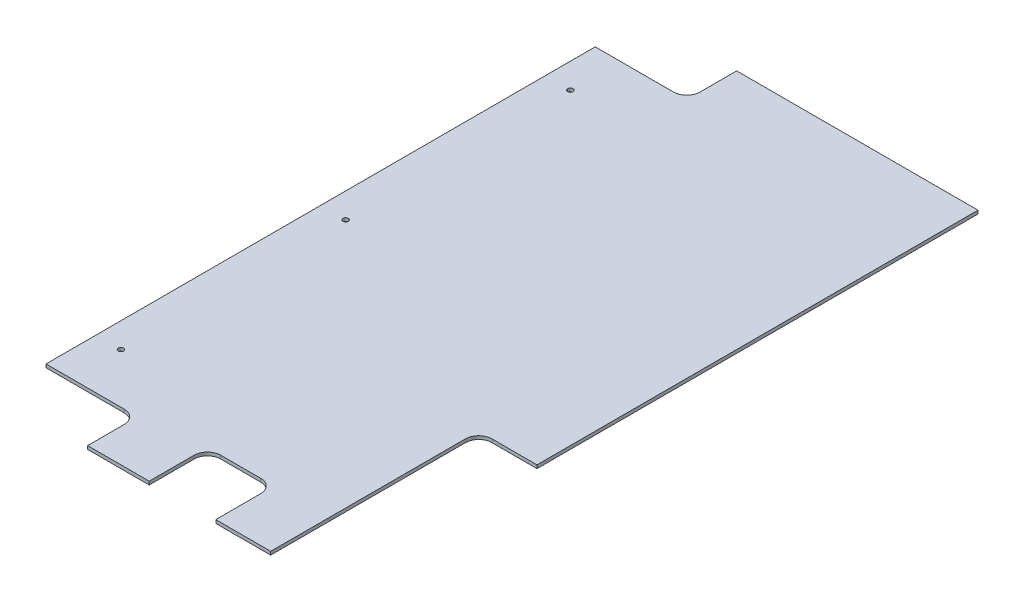
ISO-10303-21;
HEADER;
FILE_DESCRIPTION(('STEP AP214'),'2;1');
FILE_NAME('part.step','',(''),(''),'','','');
FILE_SCHEMA(('AUTOMOTIVE_DESIGN { 1 0 10303 214 1 1 1 1 }'));
ENDSEC;
DATA;
#1=APPLICATION_CONTEXT('core data for automotive mechanical design processes');
#2=APPLICATION_PROTOCOL_DEFINITION('international standard','automotive_design',2000,#1);
#3=PRODUCT_CONTEXT('',#1,'mechanical');
#4=PRODUCT('Part','Part','',(#3));
#5=PRODUCT_RELATED_PRODUCT_CATEGORY('part','',(#4));
#6=PRODUCT_DEFINITION_FORMATION('','',#4);
#7=PRODUCT_DEFINITION_CONTEXT('part definition',#1,'design');
#8=PRODUCT_DEFINITION('design','',#6,#7);
#9=PRODUCT_DEFINITION_SHAPE('','',#8);
#10=(LENGTH_UNIT() NAMED_UNIT(*) SI_UNIT(.MILLI.,.METRE.));
#11=(NAMED_UNIT(*) PLANE_ANGLE_UNIT() SI_UNIT($,.RADIAN.));
#12=(NAMED_UNIT(*) SI_UNIT($,.STERADIAN.) SOLID_ANGLE_UNIT());
#13=UNCERTAINTY_MEASURE_WITH_UNIT(LENGTH_MEASURE(1.E-05),#10,'distance_accuracy_value','');
#14=(GEOMETRIC_REPRESENTATION_CONTEXT(3) GLOBAL_UNCERTAINTY_ASSIGNED_CONTEXT((#13)) GLOBAL_UNIT_ASSIGNED_CONTEXT((#10,
#11,#12)) REPRESENTATION_CONTEXT('',''));
#15=CARTESIAN_POINT('',(0.,0.,0.));
#16=DIRECTION('',(0.,0.,1.));
#17=DIRECTION('',(1.,0.,0.));
#18=AXIS2_PLACEMENT_3D('',#15,#16,#17);
#19=CARTESIAN_POINT('',(0.,2.,0.));
#20=DIRECTION('',(0.,0.,-1.));
#21=DIRECTION('',(-1.,0.,0.));
#22=AXIS2_PLACEMENT_3D('',#19,#20,#21);
#23=PLANE('',#22);
#24=DIRECTION('',(1.,0.,0.));
#25=VECTOR('',#24,1.);
#26=CARTESIAN_POINT('',(0.,0.,0.));
#27=LINE('',#26,#25);
#28=CARTESIAN_POINT('',(132.,0.,0.));
#29=VERTEX_POINT('',#28);
#30=CARTESIAN_POINT('',(165.,0.,0.));
#31=VERTEX_POINT('',#30);
#32=EDGE_CURVE('E194',#29,#31,#27,.T.);
#33=ORIENTED_EDGE('',*,*,#32,.T.);
#34=DIRECTION('',(0.,1.,0.));
#35=VECTOR('',#34,1.);
#36=CARTESIAN_POINT('',(165.,-129.807549857472,0.));
#37=LINE('',#36,#35);
#38=CARTESIAN_POINT('',(165.,2.,0.));
#39=VERTEX_POINT('',#38);
#40=EDGE_CURVE('E180',#31,#39,#37,.T.);
#41=ORIENTED_EDGE('',*,*,#40,.T.);
#42=DIRECTION('',(1.,0.,0.));
#43=VECTOR('',#42,1.);
#44=CARTESIAN_POINT('',(0.,2.,0.));
#45=LINE('',#44,#43);
#46=CARTESIAN_POINT('',(132.,2.,0.));
#47=VERTEX_POINT('',#46);
#48=EDGE_CURVE('E192',#47,#39,#45,.T.);
#49=ORIENTED_EDGE('',*,*,#48,.F.);
#50=DIRECTION('',(0.,1.,0.));
#51=VECTOR('',#50,1.);
#52=CARTESIAN_POINT('',(132.,-53.1507290636733,0.));
#53=LINE('',#52,#51);
#54=EDGE_CURVE('E297',#29,#47,#53,.T.);
#55=ORIENTED_EDGE('',*,*,#54,.F.);
#56=EDGE_LOOP('',(#33,#41,#49,#55));
#57=FACE_BOUND('',#56,.T.);
#58=ADVANCED_FACE('F39',(#57),#23,.F.);
#59=CARTESIAN_POINT('',(0.,2.,0.));
#60=DIRECTION('',(1.,0.,0.));
#61=DIRECTION('',(0.,0.,-1.));
#62=AXIS2_PLACEMENT_3D('',#59,#60,#61);
#63=PLANE('',#62);
#64=DIRECTION('',(0.,0.,1.));
#65=VECTOR('',#64,1.);
#66=CARTESIAN_POINT('',(0.,2.,0.));
#67=LINE('',#66,#65);
#68=CARTESIAN_POINT('',(0.,2.,-360.));
#69=VERTEX_POINT('',#68);
#70=CARTESIAN_POINT('',(0.,2.,-30.));
#71=VERTEX_POINT('',#70);
#72=EDGE_CURVE('E203',#69,#71,#67,.T.);
#73=ORIENTED_EDGE('',*,*,#72,.F.);
#74=DIRECTION('',(0.,1.,0.));
#75=VECTOR('',#74,1.);
#76=CARTESIAN_POINT('',(0.,-62.6498204307084,-360.));
#77=LINE('',#76,#75);
#78=CARTESIAN_POINT('',(0.,0.,-360.));
#79=VERTEX_POINT('',#78);
#80=EDGE_CURVE('E221',#79,#69,#77,.T.);
#81=ORIENTED_EDGE('',*,*,#80,.F.);
#82=DIRECTION('',(0.,0.,1.));
#83=VECTOR('',#82,1.);
#84=CARTESIAN_POINT('',(0.,0.,0.));
#85=LINE('',#84,#83);
#86=CARTESIAN_POINT('',(0.,0.,-30.));
#87=VERTEX_POINT('',#86);
#88=EDGE_CURVE('E218',#79,#87,#85,.T.);
#89=ORIENTED_EDGE('',*,*,#88,.T.);
#90=DIRECTION('',(0.,1.,0.));
#91=VECTOR('',#90,1.);
#92=CARTESIAN_POINT('',(0.,-62.6498204307084,-30.));
#93=LINE('',#92,#91);
#94=EDGE_CURVE('E333',#87,#71,#93,.T.);
#95=ORIENTED_EDGE('',*,*,#94,.T.);
#96=EDGE_LOOP('',(#73,#81,#89,#95));
#97=FACE_BOUND('',#96,.T.);
#98=ADVANCED_FACE('F364',(#97),#63,.F.);
#99=CARTESIAN_POINT('',(55.,0.,0.));
#100=VERTEX_POINT('',#99);
#101=CARTESIAN_POINT('',(92.,0.,0.));
#102=VERTEX_POINT('',#101);
#103=EDGE_CURVE('E222',#100,#102,#27,.T.);
#104=ORIENTED_EDGE('',*,*,#103,.T.);
#105=DIRECTION('',(0.,1.,0.));
#106=VECTOR('',#105,1.);
#107=CARTESIAN_POINT('',(92.,-53.1507290636733,0.));
#108=LINE('',#107,#106);
#109=CARTESIAN_POINT('',(92.,2.,0.));
#110=VERTEX_POINT('',#109);
#111=EDGE_CURVE('E304',#102,#110,#108,.T.);
#112=ORIENTED_EDGE('',*,*,#111,.T.);
#113=CARTESIAN_POINT('',(55.,2.,0.));
#114=VERTEX_POINT('',#113);
#115=EDGE_CURVE('E202',#114,#110,#45,.T.);
#116=ORIENTED_EDGE('',*,*,#115,.F.);
#117=DIRECTION('',(0.,1.,0.));
#118=VECTOR('',#117,1.);
#119=CARTESIAN_POINT('',(55.,-62.6498204307084,0.));
#120=LINE('',#119,#118);
#121=EDGE_CURVE('E316',#100,#114,#120,.T.);
#122=ORIENTED_EDGE('',*,*,#121,.F.);
#123=EDGE_LOOP('',(#104,#112,#116,#122));
#124=FACE_BOUND('',#123,.T.);
#125=ADVANCED_FACE('F345',(#124),#23,.F.);
#126=CARTESIAN_POINT('',(200.,2.,0.));
#127=DIRECTION('',(-1.,0.,0.));
#128=DIRECTION('',(0.,0.,1.));
#129=AXIS2_PLACEMENT_3D('',#126,#127,#128);
#130=PLANE('',#129);
#131=DIRECTION('',(0.,0.,-1.));
#132=VECTOR('',#131,1.);
#133=CARTESIAN_POINT('',(200.,2.,0.));
#134=LINE('',#133,#132);
#135=CARTESIAN_POINT('',(200.,2.,-125.));
#136=VERTEX_POINT('',#135);
#137=CARTESIAN_POINT('',(200.,2.,-390.));
#138=VERTEX_POINT('',#137);
#139=EDGE_CURVE('E206',#136,#138,#134,.T.);
#140=ORIENTED_EDGE('',*,*,#139,.F.);
#141=DIRECTION('',(0.,1.,0.));
#142=VECTOR('',#141,1.);
#143=CARTESIAN_POINT('',(200.,-129.807549857472,-125.));
#144=LINE('',#143,#142);
#145=CARTESIAN_POINT('',(200.,0.,-125.));
#146=VERTEX_POINT('',#145);
#147=EDGE_CURVE('E195',#146,#136,#144,.T.);
#148=ORIENTED_EDGE('',*,*,#147,.F.);
#149=DIRECTION('',(0.,0.,-1.));
#150=VECTOR('',#149,1.);
#151=CARTESIAN_POINT('',(200.,0.,0.));
#152=LINE('',#151,#150);
#153=CARTESIAN_POINT('',(200.,0.,-390.));
#154=VERTEX_POINT('',#153);
#155=EDGE_CURVE('E225',#146,#154,#152,.T.);
#156=ORIENTED_EDGE('',*,*,#155,.T.);
#157=DIRECTION('',(0.,-1.,0.));
#158=VECTOR('',#157,1.);
#159=CARTESIAN_POINT('',(200.,2.,-390.));
#160=LINE('',#159,#158);
#161=EDGE_CURVE('E217',#138,#154,#160,.T.);
#162=ORIENTED_EDGE('',*,*,#161,.F.);
#163=EDGE_LOOP('',(#140,#148,#156,#162));
#164=FACE_BOUND('',#163,.T.);
#165=ADVANCED_FACE('F384',(#164),#130,.F.);
#166=CARTESIAN_POINT('',(0.,2.,-390.));
#167=DIRECTION('',(0.,0.,1.));
#168=DIRECTION('',(1.,0.,0.));
#169=AXIS2_PLACEMENT_3D('',#166,#167,#168);
#170=PLANE('',#169);
#171=DIRECTION('',(-1.,0.,0.));
#172=VECTOR('',#171,1.);
#173=CARTESIAN_POINT('',(0.,0.,-390.));
#174=LINE('',#173,#172);
#175=CARTESIAN_POINT('',(55.,0.,-390.));
#176=VERTEX_POINT('',#175);
#177=EDGE_CURVE('E208',#154,#176,#174,.T.);
#178=ORIENTED_EDGE('',*,*,#177,.T.);
#179=DIRECTION('',(0.,1.,0.));
#180=VECTOR('',#179,1.);
#181=CARTESIAN_POINT('',(55.,-62.6498204307084,-390.));
#182=LINE('',#181,#180);
#183=CARTESIAN_POINT('',(55.,2.,-390.));
#184=VERTEX_POINT('',#183);
#185=EDGE_CURVE('E320',#176,#184,#182,.T.);
#186=ORIENTED_EDGE('',*,*,#185,.T.);
#187=DIRECTION('',(-1.,0.,0.));
#188=VECTOR('',#187,1.);
#189=CARTESIAN_POINT('',(0.,2.,-390.));
#190=LINE('',#189,#188);
#191=EDGE_CURVE('E214',#138,#184,#190,.T.);
#192=ORIENTED_EDGE('',*,*,#191,.F.);
#193=ORIENTED_EDGE('',*,*,#161,.T.);
#194=EDGE_LOOP('',(#178,#186,#192,#193));
#195=FACE_BOUND('',#194,.T.);
#196=ADVANCED_FACE('F378',(#195),#170,.F.);
#197=CARTESIAN_POINT('',(0.,2.,0.));
#198=DIRECTION('',(0.,-1.,0.));
#199=DIRECTION('',(0.,0.,-1.));
#200=AXIS2_PLACEMENT_3D('',#197,#198,#199);
#201=PLANE('',#200);
#202=CARTESIAN_POINT('',(15.05,2.,-330.));
#203=DIRECTION('',(0.,1.,0.));
#204=DIRECTION('',(0.,0.,1.));
#205=AXIS2_PLACEMENT_3D('',#202,#203,#204);
#206=CIRCLE('',#205,1.59999999999999);
#207=CARTESIAN_POINT('',(15.05,2.,-328.4));
#208=VERTEX_POINT('',#207);
#209=EDGE_CURVE('E406',#208,#208,#206,.T.);
#210=ORIENTED_EDGE('',*,*,#209,.F.);
#211=EDGE_LOOP('',(#210));
#212=FACE_BOUND('',#211,.T.);
#213=CARTESIAN_POINT('',(15.05,2.,-195.));
#214=DIRECTION('',(0.,1.,0.));
#215=DIRECTION('',(0.,0.,1.));
#216=AXIS2_PLACEMENT_3D('',#213,#214,#215);
#217=CIRCLE('',#216,1.59999999999999);
#218=CARTESIAN_POINT('',(15.05,2.,-193.4));
#219=VERTEX_POINT('',#218);
#220=EDGE_CURVE('E399',#219,#219,#217,.T.);
#221=ORIENTED_EDGE('',*,*,#220,.F.);
#222=EDGE_LOOP('',(#221));
#223=FACE_BOUND('',#222,.T.);
#224=CARTESIAN_POINT('',(15.05,2.,-60.0000000000001));
#225=DIRECTION('',(0.,1.,0.));
#226=DIRECTION('',(0.,0.,1.));
#227=AXIS2_PLACEMENT_3D('',#224,#225,#226);
#228=CIRCLE('',#227,1.6);
#229=CARTESIAN_POINT('',(15.05,2.,-58.4));
#230=VERTEX_POINT('',#229);
#231=EDGE_CURVE('E400',#230,#230,#228,.T.);
#232=ORIENTED_EDGE('',*,*,#231,.F.);
#233=EDGE_LOOP('',(#232));
#234=FACE_BOUND('',#233,.T.);
#235=DIRECTION('',(0.,0.,1.));
#236=VECTOR('',#235,1.);
#237=CARTESIAN_POINT('',(165.,2.,0.));
#238=LINE('',#237,#236);
#239=CARTESIAN_POINT('',(165.,2.,-117.));
#240=VERTEX_POINT('',#239);
#241=EDGE_CURVE('E176',#240,#39,#238,.T.);
#242=ORIENTED_EDGE('',*,*,#241,.F.);
#243=CARTESIAN_POINT('',(173.,2.,-117.));
#244=DIRECTION('',(0.,-1.,0.));
#245=DIRECTION('',(0.,0.,-1.));
#246=AXIS2_PLACEMENT_3D('',#243,#244,#245);
#247=CIRCLE('',#246,8.);
#248=CARTESIAN_POINT('',(173.,2.,-125.));
#249=VERTEX_POINT('',#248);
#250=EDGE_CURVE('E256',#240,#249,#247,.T.);
#251=ORIENTED_EDGE('',*,*,#250,.T.);
#252=DIRECTION('',(-1.,0.,0.));
#253=VECTOR('',#252,1.);
#254=CARTESIAN_POINT('',(200.,2.,-125.));
#255=LINE('',#254,#253);
#256=EDGE_CURVE('E187',#136,#249,#255,.T.);
#257=ORIENTED_EDGE('',*,*,#256,.F.);
#258=ORIENTED_EDGE('',*,*,#139,.T.);
#259=ORIENTED_EDGE('',*,*,#191,.T.);
#260=DIRECTION('',(0.,0.,-1.));
#261=VECTOR('',#260,1.);
#262=CARTESIAN_POINT('',(55.,2.,-390.));
#263=LINE('',#262,#261);
#264=CARTESIAN_POINT('',(55.,2.,-368.));
#265=VERTEX_POINT('',#264);
#266=EDGE_CURVE('E311',#265,#184,#263,.T.);
#267=ORIENTED_EDGE('',*,*,#266,.F.);
#268=CARTESIAN_POINT('',(47.,2.,-368.));
#269=DIRECTION('',(0.,-1.,0.));
#270=DIRECTION('',(0.,0.,-1.));
#271=AXIS2_PLACEMENT_3D('',#268,#269,#270);
#272=CIRCLE('',#271,8.);
#273=CARTESIAN_POINT('',(47.,2.,-360.));
#274=VERTEX_POINT('',#273);
#275=EDGE_CURVE('E47',#265,#274,#272,.T.);
#276=ORIENTED_EDGE('',*,*,#275,.T.);
#277=DIRECTION('',(1.,0.,0.));
#278=VECTOR('',#277,1.);
#279=CARTESIAN_POINT('',(0.,2.,-360.));
#280=LINE('',#279,#278);
#281=EDGE_CURVE('E314',#69,#274,#280,.T.);
#282=ORIENTED_EDGE('',*,*,#281,.F.);
#283=ORIENTED_EDGE('',*,*,#72,.T.);
#284=DIRECTION('',(-1.,0.,0.));
#285=VECTOR('',#284,1.);
#286=CARTESIAN_POINT('',(0.,2.,-30.));
#287=LINE('',#286,#285);
#288=CARTESIAN_POINT('',(47.,2.,-30.));
#289=VERTEX_POINT('',#288);
#290=EDGE_CURVE('E324',#289,#71,#287,.T.);
#291=ORIENTED_EDGE('',*,*,#290,.F.);
#292=CARTESIAN_POINT('',(47.,2.,-22.));
#293=DIRECTION('',(0.,-1.,0.));
#294=DIRECTION('',(0.,0.,-1.));
#295=AXIS2_PLACEMENT_3D('',#292,#293,#294);
#296=CIRCLE('',#295,8.);
#297=CARTESIAN_POINT('',(55.,2.,-22.));
#298=VERTEX_POINT('',#297);
#299=EDGE_CURVE('E262',#289,#298,#296,.T.);
#300=ORIENTED_EDGE('',*,*,#299,.T.);
#301=DIRECTION('',(0.,0.,-1.));
#302=VECTOR('',#301,1.);
#303=CARTESIAN_POINT('',(55.,2.,0.));
#304=LINE('',#303,#302);
#305=EDGE_CURVE('E310',#114,#298,#304,.T.);
#306=ORIENTED_EDGE('',*,*,#305,.F.);
#307=ORIENTED_EDGE('',*,*,#115,.T.);
#308=DIRECTION('',(0.,0.,1.));
#309=VECTOR('',#308,1.);
#310=CARTESIAN_POINT('',(92.,2.,0.));
#311=LINE('',#310,#309);
#312=CARTESIAN_POINT('',(92.,2.,-27.));
#313=VERTEX_POINT('',#312);
#314=EDGE_CURVE('E298',#313,#110,#311,.T.);
#315=ORIENTED_EDGE('',*,*,#314,.F.);
#316=CARTESIAN_POINT('',(100.,2.,-27.));
#317=DIRECTION('',(0.,-1.,0.));
#318=DIRECTION('',(0.,0.,-1.));
#319=AXIS2_PLACEMENT_3D('',#316,#317,#318);
#320=CIRCLE('',#319,8.);
#321=CARTESIAN_POINT('',(100.,2.,-35.));
#322=VERTEX_POINT('',#321);
#323=EDGE_CURVE('E266',#313,#322,#320,.T.);
#324=ORIENTED_EDGE('',*,*,#323,.T.);
#325=DIRECTION('',(-1.,0.,0.));
#326=VECTOR('',#325,1.);
#327=CARTESIAN_POINT('',(92.,2.,-35.));
#328=LINE('',#327,#326);
#329=CARTESIAN_POINT('',(124.,2.,-35.));
#330=VERTEX_POINT('',#329);
#331=EDGE_CURVE('E294',#330,#322,#328,.T.);
#332=ORIENTED_EDGE('',*,*,#331,.F.);
#333=CARTESIAN_POINT('',(124.,2.,-27.));
#334=DIRECTION('',(0.,-1.,0.));
#335=DIRECTION('',(0.,0.,-1.));
#336=AXIS2_PLACEMENT_3D('',#333,#334,#335);
#337=CIRCLE('',#336,8.);
#338=CARTESIAN_POINT('',(132.,2.,-27.));
#339=VERTEX_POINT('',#338);
#340=EDGE_CURVE('E270',#330,#339,#337,.T.);
#341=ORIENTED_EDGE('',*,*,#340,.T.);
#342=DIRECTION('',(0.,0.,-1.));
#343=VECTOR('',#342,1.);
#344=CARTESIAN_POINT('',(132.,2.,0.));
#345=LINE('',#344,#343);
#346=EDGE_CURVE('E201',#47,#339,#345,.T.);
#347=ORIENTED_EDGE('',*,*,#346,.F.);
#348=ORIENTED_EDGE('',*,*,#48,.T.);
#349=EDGE_LOOP('',(#242,#251,#257,#258,#259,#267,#276,#282,#283,#291,#300,#306,#307,#315,#324,
#332,#341,#347,#348));
#350=FACE_BOUND('',#349,.T.);
#351=ADVANCED_FACE('F199',(#212,#223,#234,#350),#201,.F.);
#352=CARTESIAN_POINT('',(0.,0.,0.));
#353=DIRECTION('',(0.,-1.,0.));
#354=DIRECTION('',(0.,0.,-1.));
#355=AXIS2_PLACEMENT_3D('',#352,#353,#354);
#356=PLANE('',#355);
#357=CARTESIAN_POINT('',(15.05,0.,-330.));
#358=DIRECTION('',(0.,-1.,0.));
#359=DIRECTION('',(0.,0.,-1.));
#360=AXIS2_PLACEMENT_3D('',#357,#358,#359);
#361=CIRCLE('',#360,1.59999999999999);
#362=CARTESIAN_POINT('',(15.05,0.,-331.6));
#363=VERTEX_POINT('',#362);
#364=EDGE_CURVE('E394',#363,#363,#361,.F.);
#365=ORIENTED_EDGE('',*,*,#364,.T.);
#366=EDGE_LOOP('',(#365));
#367=FACE_BOUND('',#366,.T.);
#368=CARTESIAN_POINT('',(15.05,0.,-195.));
#369=DIRECTION('',(0.,-1.,0.));
#370=DIRECTION('',(0.,0.,-1.));
#371=AXIS2_PLACEMENT_3D('',#368,#369,#370);
#372=CIRCLE('',#371,1.59999999999999);
#373=CARTESIAN_POINT('',(15.05,0.,-196.6));
#374=VERTEX_POINT('',#373);
#375=EDGE_CURVE('E403',#374,#374,#372,.F.);
#376=ORIENTED_EDGE('',*,*,#375,.T.);
#377=EDGE_LOOP('',(#376));
#378=FACE_BOUND('',#377,.T.);
#379=CARTESIAN_POINT('',(15.05,0.,-60.0000000000001));
#380=DIRECTION('',(0.,-1.,0.));
#381=DIRECTION('',(0.,0.,-1.));
#382=AXIS2_PLACEMENT_3D('',#379,#380,#381);
#383=CIRCLE('',#382,1.6);
#384=CARTESIAN_POINT('',(15.05,0.,-61.6000000000001));
#385=VERTEX_POINT('',#384);
#386=EDGE_CURVE('E396',#385,#385,#383,.F.);
#387=ORIENTED_EDGE('',*,*,#386,.T.);
#388=EDGE_LOOP('',(#387));
#389=FACE_BOUND('',#388,.T.);
#390=DIRECTION('',(-1.,0.,0.));
#391=VECTOR('',#390,1.);
#392=CARTESIAN_POINT('',(200.,0.,-125.));
#393=LINE('',#392,#391);
#394=CARTESIAN_POINT('',(173.,0.,-125.));
#395=VERTEX_POINT('',#394);
#396=EDGE_CURVE('E186',#146,#395,#393,.T.);
#397=ORIENTED_EDGE('',*,*,#396,.T.);
#398=CARTESIAN_POINT('',(173.,0.,-117.));
#399=DIRECTION('',(0.,-1.,0.));
#400=DIRECTION('',(0.,0.,-1.));
#401=AXIS2_PLACEMENT_3D('',#398,#399,#400);
#402=CIRCLE('',#401,8.);
#403=CARTESIAN_POINT('',(165.,0.,-117.));
#404=VERTEX_POINT('',#403);
#405=EDGE_CURVE('E259',#395,#404,#402,.F.);
#406=ORIENTED_EDGE('',*,*,#405,.T.);
#407=DIRECTION('',(0.,0.,1.));
#408=VECTOR('',#407,1.);
#409=CARTESIAN_POINT('',(165.,0.,0.));
#410=LINE('',#409,#408);
#411=EDGE_CURVE('E196',#404,#31,#410,.T.);
#412=ORIENTED_EDGE('',*,*,#411,.T.);
#413=ORIENTED_EDGE('',*,*,#32,.F.);
#414=DIRECTION('',(0.,0.,-1.));
#415=VECTOR('',#414,1.);
#416=CARTESIAN_POINT('',(132.,0.,0.));
#417=LINE('',#416,#415);
#418=CARTESIAN_POINT('',(132.,0.,-27.));
#419=VERTEX_POINT('',#418);
#420=EDGE_CURVE('E282',#29,#419,#417,.T.);
#421=ORIENTED_EDGE('',*,*,#420,.T.);
#422=CARTESIAN_POINT('',(124.,0.,-27.));
#423=DIRECTION('',(0.,-1.,0.));
#424=DIRECTION('',(0.,0.,-1.));
#425=AXIS2_PLACEMENT_3D('',#422,#423,#424);
#426=CIRCLE('',#425,8.);
#427=CARTESIAN_POINT('',(124.,0.,-35.));
#428=VERTEX_POINT('',#427);
#429=EDGE_CURVE('E272',#419,#428,#426,.F.);
#430=ORIENTED_EDGE('',*,*,#429,.T.);
#431=DIRECTION('',(-1.,0.,0.));
#432=VECTOR('',#431,1.);
#433=CARTESIAN_POINT('',(92.,0.,-35.));
#434=LINE('',#433,#432);
#435=CARTESIAN_POINT('',(100.,0.,-35.));
#436=VERTEX_POINT('',#435);
#437=EDGE_CURVE('E280',#428,#436,#434,.T.);
#438=ORIENTED_EDGE('',*,*,#437,.T.);
#439=CARTESIAN_POINT('',(100.,0.,-27.));
#440=DIRECTION('',(0.,-1.,0.));
#441=DIRECTION('',(0.,0.,-1.));
#442=AXIS2_PLACEMENT_3D('',#439,#440,#441);
#443=CIRCLE('',#442,8.);
#444=CARTESIAN_POINT('',(92.,0.,-27.));
#445=VERTEX_POINT('',#444);
#446=EDGE_CURVE('E268',#436,#445,#443,.F.);
#447=ORIENTED_EDGE('',*,*,#446,.T.);
#448=DIRECTION('',(0.,0.,1.));
#449=VECTOR('',#448,1.);
#450=CARTESIAN_POINT('',(92.,0.,0.));
#451=LINE('',#450,#449);
#452=EDGE_CURVE('E291',#445,#102,#451,.T.);
#453=ORIENTED_EDGE('',*,*,#452,.T.);
#454=ORIENTED_EDGE('',*,*,#103,.F.);
#455=DIRECTION('',(0.,0.,-1.));
#456=VECTOR('',#455,1.);
#457=CARTESIAN_POINT('',(55.,0.,0.));
#458=LINE('',#457,#456);
#459=CARTESIAN_POINT('',(55.,0.,-22.));
#460=VERTEX_POINT('',#459);
#461=EDGE_CURVE('E326',#100,#460,#458,.T.);
#462=ORIENTED_EDGE('',*,*,#461,.T.);
#463=CARTESIAN_POINT('',(47.,0.,-22.));
#464=DIRECTION('',(0.,-1.,0.));
#465=DIRECTION('',(0.,0.,-1.));
#466=AXIS2_PLACEMENT_3D('',#463,#464,#465);
#467=CIRCLE('',#466,8.);
#468=CARTESIAN_POINT('',(47.,0.,-30.));
#469=VERTEX_POINT('',#468);
#470=EDGE_CURVE('E264',#460,#469,#467,.F.);
#471=ORIENTED_EDGE('',*,*,#470,.T.);
#472=DIRECTION('',(-1.,0.,0.));
#473=VECTOR('',#472,1.);
#474=CARTESIAN_POINT('',(0.,0.,-30.));
#475=LINE('',#474,#473);
#476=EDGE_CURVE('E331',#469,#87,#475,.T.);
#477=ORIENTED_EDGE('',*,*,#476,.T.);
#478=ORIENTED_EDGE('',*,*,#88,.F.);
#479=DIRECTION('',(1.,0.,0.));
#480=VECTOR('',#479,1.);
#481=CARTESIAN_POINT('',(0.,0.,-360.));
#482=LINE('',#481,#480);
#483=CARTESIAN_POINT('',(47.,0.,-360.));
#484=VERTEX_POINT('',#483);
#485=EDGE_CURVE('E313',#79,#484,#482,.T.);
#486=ORIENTED_EDGE('',*,*,#485,.T.);
#487=CARTESIAN_POINT('',(47.,0.,-368.));
#488=DIRECTION('',(0.,-1.,0.));
#489=DIRECTION('',(0.,0.,-1.));
#490=AXIS2_PLACEMENT_3D('',#487,#488,#489);
#491=CIRCLE('',#490,8.);
#492=CARTESIAN_POINT('',(55.,0.,-368.));
#493=VERTEX_POINT('',#492);
#494=EDGE_CURVE('E11',#484,#493,#491,.F.);
#495=ORIENTED_EDGE('',*,*,#494,.T.);
#496=DIRECTION('',(0.,0.,-1.));
#497=VECTOR('',#496,1.);
#498=CARTESIAN_POINT('',(55.,0.,-390.));
#499=LINE('',#498,#497);
#500=EDGE_CURVE('E318',#493,#176,#499,.T.);
#501=ORIENTED_EDGE('',*,*,#500,.T.);
#502=ORIENTED_EDGE('',*,*,#177,.F.);
#503=ORIENTED_EDGE('',*,*,#155,.F.);
#504=EDGE_LOOP('',(#397,#406,#412,#413,#421,#430,#438,#447,#453,#454,#462,#471,#477,#478,#486,
#495,#501,#502,#503));
#505=FACE_BOUND('',#504,.T.);
#506=ADVANCED_FACE('F279',(#367,#378,#389,#505),#356,.T.);
#507=CARTESIAN_POINT('',(55.,-62.6498204307084,0.));
#508=DIRECTION('',(1.,0.,0.));
#509=DIRECTION('',(0.,0.,-1.));
#510=AXIS2_PLACEMENT_3D('',#507,#508,#509);
#511=PLANE('',#510);
#512=ORIENTED_EDGE('',*,*,#305,.T.);
#513=DIRECTION('',(0.,1.,0.));
#514=VECTOR('',#513,1.);
#515=CARTESIAN_POINT('',(55.,0.,-22.));
#516=LINE('',#515,#514);
#517=EDGE_CURVE('E240',#298,#460,#516,.F.);
#518=ORIENTED_EDGE('',*,*,#517,.T.);
#519=ORIENTED_EDGE('',*,*,#461,.F.);
#520=ORIENTED_EDGE('',*,*,#121,.T.);
#521=EDGE_LOOP('',(#512,#518,#519,#520));
#522=FACE_BOUND('',#521,.T.);
#523=ADVANCED_FACE('F338',(#522),#511,.F.);
#524=CARTESIAN_POINT('',(0.,-62.6498204307084,-30.));
#525=DIRECTION('',(0.,0.,-1.));
#526=DIRECTION('',(-1.,0.,0.));
#527=AXIS2_PLACEMENT_3D('',#524,#525,#526);
#528=PLANE('',#527);
#529=ORIENTED_EDGE('',*,*,#476,.F.);
#530=DIRECTION('',(0.,1.,0.));
#531=VECTOR('',#530,1.);
#532=CARTESIAN_POINT('',(47.,2.,-30.));
#533=LINE('',#532,#531);
#534=EDGE_CURVE('E237',#469,#289,#533,.T.);
#535=ORIENTED_EDGE('',*,*,#534,.T.);
#536=ORIENTED_EDGE('',*,*,#290,.T.);
#537=ORIENTED_EDGE('',*,*,#94,.F.);
#538=EDGE_LOOP('',(#529,#535,#536,#537));
#539=FACE_BOUND('',#538,.T.);
#540=ADVANCED_FACE('F359',(#539),#528,.F.);
#541=CARTESIAN_POINT('',(0.,-62.6498204307084,-360.));
#542=DIRECTION('',(0.,0.,1.));
#543=DIRECTION('',(1.,0.,0.));
#544=AXIS2_PLACEMENT_3D('',#541,#542,#543);
#545=PLANE('',#544);
#546=ORIENTED_EDGE('',*,*,#281,.T.);
#547=DIRECTION('',(0.,1.,0.));
#548=VECTOR('',#547,1.);
#549=CARTESIAN_POINT('',(47.,0.,-360.));
#550=LINE('',#549,#548);
#551=EDGE_CURVE('E54',#274,#484,#550,.F.);
#552=ORIENTED_EDGE('',*,*,#551,.T.);
#553=ORIENTED_EDGE('',*,*,#485,.F.);
#554=ORIENTED_EDGE('',*,*,#80,.T.);
#555=EDGE_LOOP('',(#546,#552,#553,#554));
#556=FACE_BOUND('',#555,.T.);
#557=ADVANCED_FACE('F486',(#556),#545,.F.);
#558=CARTESIAN_POINT('',(55.,-62.6498204307084,-390.));
#559=DIRECTION('',(1.,0.,0.));
#560=DIRECTION('',(0.,0.,-1.));
#561=AXIS2_PLACEMENT_3D('',#558,#559,#560);
#562=PLANE('',#561);
#563=ORIENTED_EDGE('',*,*,#500,.F.);
#564=DIRECTION('',(0.,1.,0.));
#565=VECTOR('',#564,1.);
#566=CARTESIAN_POINT('',(55.,2.,-368.));
#567=LINE('',#566,#565);
#568=EDGE_CURVE('E252',#493,#265,#567,.T.);
#569=ORIENTED_EDGE('',*,*,#568,.T.);
#570=ORIENTED_EDGE('',*,*,#266,.T.);
#571=ORIENTED_EDGE('',*,*,#185,.F.);
#572=EDGE_LOOP('',(#563,#569,#570,#571));
#573=FACE_BOUND('',#572,.T.);
#574=ADVANCED_FACE('F371',(#573),#562,.F.);
#575=CARTESIAN_POINT('',(132.,-53.1507290636733,0.));
#576=DIRECTION('',(1.,0.,0.));
#577=DIRECTION('',(0.,0.,-1.));
#578=AXIS2_PLACEMENT_3D('',#575,#576,#577);
#579=PLANE('',#578);
#580=ORIENTED_EDGE('',*,*,#346,.T.);
#581=DIRECTION('',(0.,1.,0.));
#582=VECTOR('',#581,1.);
#583=CARTESIAN_POINT('',(132.,0.,-27.));
#584=LINE('',#583,#582);
#585=EDGE_CURVE('E250',#339,#419,#584,.F.);
#586=ORIENTED_EDGE('',*,*,#585,.T.);
#587=ORIENTED_EDGE('',*,*,#420,.F.);
#588=ORIENTED_EDGE('',*,*,#54,.T.);
#589=EDGE_LOOP('',(#580,#586,#587,#588));
#590=FACE_BOUND('',#589,.T.);
#591=ADVANCED_FACE('F296',(#590),#579,.F.);
#592=CARTESIAN_POINT('',(92.,-53.1507290636733,-35.));
#593=DIRECTION('',(0.,0.,-1.));
#594=DIRECTION('',(-1.,0.,0.));
#595=AXIS2_PLACEMENT_3D('',#592,#593,#594);
#596=PLANE('',#595);
#597=ORIENTED_EDGE('',*,*,#331,.T.);
#598=DIRECTION('',(0.,1.,0.));
#599=VECTOR('',#598,1.);
#600=CARTESIAN_POINT('',(100.,0.,-35.));
#601=LINE('',#600,#599);
#602=EDGE_CURVE('E248',#322,#436,#601,.F.);
#603=ORIENTED_EDGE('',*,*,#602,.T.);
#604=ORIENTED_EDGE('',*,*,#437,.F.);
#605=DIRECTION('',(0.,1.,0.));
#606=VECTOR('',#605,1.);
#607=CARTESIAN_POINT('',(124.,2.,-35.));
#608=LINE('',#607,#606);
#609=EDGE_CURVE('E245',#428,#330,#608,.T.);
#610=ORIENTED_EDGE('',*,*,#609,.T.);
#611=EDGE_LOOP('',(#597,#603,#604,#610));
#612=FACE_BOUND('',#611,.T.);
#613=ADVANCED_FACE('F288',(#612),#596,.F.);
#614=CARTESIAN_POINT('',(92.,-53.1507290636733,0.));
#615=DIRECTION('',(-1.,0.,0.));
#616=DIRECTION('',(0.,0.,1.));
#617=AXIS2_PLACEMENT_3D('',#614,#615,#616);
#618=PLANE('',#617);
#619=ORIENTED_EDGE('',*,*,#452,.F.);
#620=DIRECTION('',(0.,1.,0.));
#621=VECTOR('',#620,1.);
#622=CARTESIAN_POINT('',(92.,2.,-27.));
#623=LINE('',#622,#621);
#624=EDGE_CURVE('E242',#445,#313,#623,.T.);
#625=ORIENTED_EDGE('',*,*,#624,.T.);
#626=ORIENTED_EDGE('',*,*,#314,.T.);
#627=ORIENTED_EDGE('',*,*,#111,.F.);
#628=EDGE_LOOP('',(#619,#625,#626,#627));
#629=FACE_BOUND('',#628,.T.);
#630=ADVANCED_FACE('F349',(#629),#618,.F.);
#631=CARTESIAN_POINT('',(200.,-129.807549857472,-125.));
#632=DIRECTION('',(0.,0.,-1.));
#633=DIRECTION('',(-1.,0.,0.));
#634=AXIS2_PLACEMENT_3D('',#631,#632,#633);
#635=PLANE('',#634);
#636=ORIENTED_EDGE('',*,*,#256,.T.);
#637=DIRECTION('',(0.,1.,0.));
#638=VECTOR('',#637,1.);
#639=CARTESIAN_POINT('',(173.,0.,-125.));
#640=LINE('',#639,#638);
#641=EDGE_CURVE('E234',#249,#395,#640,.F.);
#642=ORIENTED_EDGE('',*,*,#641,.T.);
#643=ORIENTED_EDGE('',*,*,#396,.F.);
#644=ORIENTED_EDGE('',*,*,#147,.T.);
#645=EDGE_LOOP('',(#636,#642,#643,#644));
#646=FACE_BOUND('',#645,.T.);
#647=ADVANCED_FACE('F528',(#646),#635,.F.);
#648=CARTESIAN_POINT('',(165.,-129.807549857472,0.));
#649=DIRECTION('',(-1.,0.,0.));
#650=DIRECTION('',(0.,0.,1.));
#651=AXIS2_PLACEMENT_3D('',#648,#649,#650);
#652=PLANE('',#651);
#653=ORIENTED_EDGE('',*,*,#411,.F.);
#654=DIRECTION('',(0.,1.,0.));
#655=VECTOR('',#654,1.);
#656=CARTESIAN_POINT('',(165.,2.,-117.));
#657=LINE('',#656,#655);
#658=EDGE_CURVE('E183',#404,#240,#657,.T.);
#659=ORIENTED_EDGE('',*,*,#658,.T.);
#660=ORIENTED_EDGE('',*,*,#241,.T.);
#661=ORIENTED_EDGE('',*,*,#40,.F.);
#662=EDGE_LOOP('',(#653,#659,#660,#661));
#663=FACE_BOUND('',#662,.T.);
#664=ADVANCED_FACE('F179',(#663),#652,.F.);
#665=CARTESIAN_POINT('',(15.05,-4.52548339959392,-60.0000000000001));
#666=DIRECTION('',(0.,1.,0.));
#667=DIRECTION('',(0.,0.,1.));
#668=AXIS2_PLACEMENT_3D('',#665,#666,#667);
#669=CYLINDRICAL_SURFACE('',#668,1.6);
#670=ORIENTED_EDGE('',*,*,#231,.T.);
#671=EDGE_LOOP('',(#670));
#672=FACE_BOUND('',#671,.T.);
#673=ORIENTED_EDGE('',*,*,#386,.F.);
#674=EDGE_LOOP('',(#673));
#675=FACE_BOUND('',#674,.T.);
#676=ADVANCED_FACE('F424',(#672,#675),#669,.F.);
#677=CARTESIAN_POINT('',(15.05,-4.52548339959392,-195.));
#678=DIRECTION('',(0.,1.,0.));
#679=DIRECTION('',(0.,0.,1.));
#680=AXIS2_PLACEMENT_3D('',#677,#678,#679);
#681=CYLINDRICAL_SURFACE('',#680,1.59999999999999);
#682=ORIENTED_EDGE('',*,*,#220,.T.);
#683=EDGE_LOOP('',(#682));
#684=FACE_BOUND('',#683,.T.);
#685=ORIENTED_EDGE('',*,*,#375,.F.);
#686=EDGE_LOOP('',(#685));
#687=FACE_BOUND('',#686,.T.);
#688=ADVANCED_FACE('F427',(#684,#687),#681,.F.);
#689=CARTESIAN_POINT('',(15.05,-4.52548339959392,-330.));
#690=DIRECTION('',(0.,1.,0.));
#691=DIRECTION('',(0.,0.,1.));
#692=AXIS2_PLACEMENT_3D('',#689,#690,#691);
#693=CYLINDRICAL_SURFACE('',#692,1.59999999999999);
#694=ORIENTED_EDGE('',*,*,#209,.T.);
#695=EDGE_LOOP('',(#694));
#696=FACE_BOUND('',#695,.T.);
#697=ORIENTED_EDGE('',*,*,#364,.F.);
#698=EDGE_LOOP('',(#697));
#699=FACE_BOUND('',#698,.T.);
#700=ADVANCED_FACE('F414',(#696,#699),#693,.F.);
#701=CARTESIAN_POINT('',(173.,-129.807549857472,-117.));
#702=DIRECTION('',(0.,-1.,0.));
#703=DIRECTION('',(0.,0.,-1.));
#704=AXIS2_PLACEMENT_3D('',#701,#702,#703);
#705=CYLINDRICAL_SURFACE('',#704,8.);
#706=ORIENTED_EDGE('',*,*,#405,.F.);
#707=ORIENTED_EDGE('',*,*,#641,.F.);
#708=ORIENTED_EDGE('',*,*,#250,.F.);
#709=ORIENTED_EDGE('',*,*,#658,.F.);
#710=EDGE_LOOP('',(#706,#707,#708,#709));
#711=FACE_BOUND('',#710,.T.);
#712=ADVANCED_FACE('F562',(#711),#705,.F.);
#713=CARTESIAN_POINT('',(47.,-62.6498204307084,-22.));
#714=DIRECTION('',(0.,-1.,0.));
#715=DIRECTION('',(0.,0.,-1.));
#716=AXIS2_PLACEMENT_3D('',#713,#714,#715);
#717=CYLINDRICAL_SURFACE('',#716,8.);
#718=ORIENTED_EDGE('',*,*,#470,.F.);
#719=ORIENTED_EDGE('',*,*,#517,.F.);
#720=ORIENTED_EDGE('',*,*,#299,.F.);
#721=ORIENTED_EDGE('',*,*,#534,.F.);
#722=EDGE_LOOP('',(#718,#719,#720,#721));
#723=FACE_BOUND('',#722,.T.);
#724=ADVANCED_FACE('F357',(#723),#717,.F.);
#725=CARTESIAN_POINT('',(100.,-53.1507290636733,-27.));
#726=DIRECTION('',(0.,-1.,0.));
#727=DIRECTION('',(0.,0.,-1.));
#728=AXIS2_PLACEMENT_3D('',#725,#726,#727);
#729=CYLINDRICAL_SURFACE('',#728,8.);
#730=ORIENTED_EDGE('',*,*,#446,.F.);
#731=ORIENTED_EDGE('',*,*,#602,.F.);
#732=ORIENTED_EDGE('',*,*,#323,.F.);
#733=ORIENTED_EDGE('',*,*,#624,.F.);
#734=EDGE_LOOP('',(#730,#731,#732,#733));
#735=FACE_BOUND('',#734,.T.);
#736=ADVANCED_FACE('F352',(#735),#729,.F.);
#737=CARTESIAN_POINT('',(124.,-53.1507290636733,-27.));
#738=DIRECTION('',(0.,-1.,0.));
#739=DIRECTION('',(0.,0.,-1.));
#740=AXIS2_PLACEMENT_3D('',#737,#738,#739);
#741=CYLINDRICAL_SURFACE('',#740,8.);
#742=ORIENTED_EDGE('',*,*,#429,.F.);
#743=ORIENTED_EDGE('',*,*,#585,.F.);
#744=ORIENTED_EDGE('',*,*,#340,.F.);
#745=ORIENTED_EDGE('',*,*,#609,.F.);
#746=EDGE_LOOP('',(#742,#743,#744,#745));
#747=FACE_BOUND('',#746,.T.);
#748=ADVANCED_FACE('F293',(#747),#741,.F.);
#749=CARTESIAN_POINT('',(47.,-62.6498204307084,-368.));
#750=DIRECTION('',(0.,-1.,0.));
#751=DIRECTION('',(0.,0.,-1.));
#752=AXIS2_PLACEMENT_3D('',#749,#750,#751);
#753=CYLINDRICAL_SURFACE('',#752,8.);
#754=ORIENTED_EDGE('',*,*,#494,.F.);
#755=ORIENTED_EDGE('',*,*,#551,.F.);
#756=ORIENTED_EDGE('',*,*,#275,.F.);
#757=ORIENTED_EDGE('',*,*,#568,.F.);
#758=EDGE_LOOP('',(#754,#755,#756,#757));
#759=FACE_BOUND('',#758,.T.);
#760=ADVANCED_FACE('F41',(#759),#753,.F.);
#761=CLOSED_SHELL('',(#58,#98,#125,#165,#196,#351,#506,#523,#540,#557,#574,#591,#613,#630,#647,
#664,#676,#688,#700,#712,#724,#736,#748,#760));
#762=MANIFOLD_SOLID_BREP('B2',#761);
#763=ADVANCED_BREP_SHAPE_REPRESENTATION('',(#18,#762),#14);
#764=SHAPE_DEFINITION_REPRESENTATION(#9,#763);
ENDSEC;
END-ISO-10303-21;
